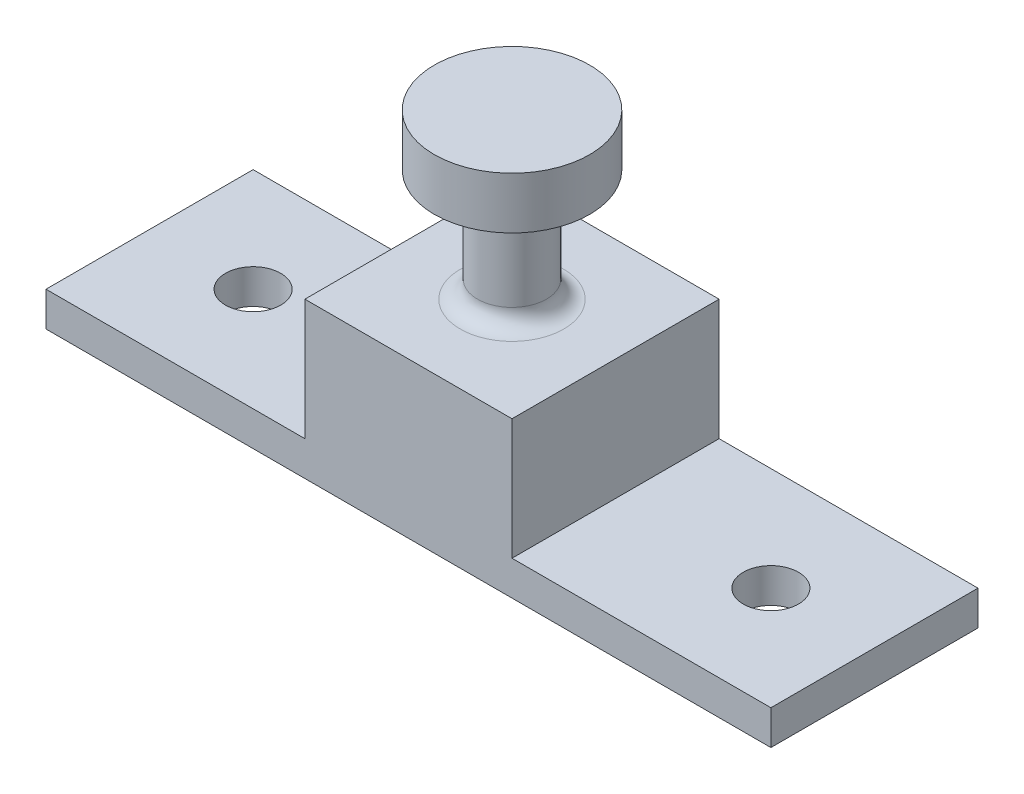
ISO-10303-21;
HEADER;
FILE_DESCRIPTION(('STEP AP214'),'2;1');
FILE_NAME('part.step','',(''),(''),'','','');
FILE_SCHEMA(('AUTOMOTIVE_DESIGN { 1 0 10303 214 1 1 1 1 }'));
ENDSEC;
DATA;
#1=APPLICATION_CONTEXT('core data for automotive mechanical design processes');
#2=APPLICATION_PROTOCOL_DEFINITION('international standard','automotive_design',2000,#1);
#3=PRODUCT_CONTEXT('',#1,'mechanical');
#4=PRODUCT('Part','Part','',(#3));
#5=PRODUCT_RELATED_PRODUCT_CATEGORY('part','',(#4));
#6=PRODUCT_DEFINITION_FORMATION('','',#4);
#7=PRODUCT_DEFINITION_CONTEXT('part definition',#1,'design');
#8=PRODUCT_DEFINITION('design','',#6,#7);
#9=PRODUCT_DEFINITION_SHAPE('','',#8);
#10=(LENGTH_UNIT() NAMED_UNIT(*) SI_UNIT(.MILLI.,.METRE.));
#11=(NAMED_UNIT(*) PLANE_ANGLE_UNIT() SI_UNIT($,.RADIAN.));
#12=(NAMED_UNIT(*) SI_UNIT($,.STERADIAN.) SOLID_ANGLE_UNIT());
#13=UNCERTAINTY_MEASURE_WITH_UNIT(LENGTH_MEASURE(1.E-05),#10,'distance_accuracy_value','');
#14=(GEOMETRIC_REPRESENTATION_CONTEXT(3) GLOBAL_UNCERTAINTY_ASSIGNED_CONTEXT((#13)) GLOBAL_UNIT_ASSIGNED_CONTEXT((#10,
#11,#12)) REPRESENTATION_CONTEXT('',''));
#15=CARTESIAN_POINT('',(0.,0.,0.));
#16=DIRECTION('',(0.,0.,1.));
#17=DIRECTION('',(1.,0.,0.));
#18=AXIS2_PLACEMENT_3D('',#15,#16,#17);
#19=CARTESIAN_POINT('',(0.,2.,0.));
#20=DIRECTION('',(0.,-1.,0.));
#21=DIRECTION('',(0.,0.,-1.));
#22=AXIS2_PLACEMENT_3D('',#19,#20,#21);
#23=PLANE('',#22);
#24=CARTESIAN_POINT('',(15.,2.,0.));
#25=DIRECTION('',(0.,1.,0.));
#26=DIRECTION('',(0.,0.,1.));
#27=AXIS2_PLACEMENT_3D('',#24,#25,#26);
#28=CIRCLE('',#27,1.6);
#29=CARTESIAN_POINT('',(15.,2.,1.6));
#30=VERTEX_POINT('',#29);
#31=EDGE_CURVE('E123',#30,#30,#28,.T.);
#32=ORIENTED_EDGE('',*,*,#31,.F.);
#33=EDGE_LOOP('',(#32));
#34=FACE_BOUND('',#33,.T.);
#35=DIRECTION('',(0.,0.,-1.));
#36=VECTOR('',#35,1.);
#37=CARTESIAN_POINT('',(6.,2.,6.));
#38=LINE('',#37,#36);
#39=CARTESIAN_POINT('',(5.99999999999999,2.,6.));
#40=VERTEX_POINT('',#39);
#41=CARTESIAN_POINT('',(5.99999999999999,2.,-6.));
#42=VERTEX_POINT('',#41);
#43=EDGE_CURVE('E49',#40,#42,#38,.T.);
#44=ORIENTED_EDGE('',*,*,#43,.F.);
#45=DIRECTION('',(1.,0.,0.));
#46=VECTOR('',#45,1.);
#47=CARTESIAN_POINT('',(-21.,2.,6.));
#48=LINE('',#47,#46);
#49=CARTESIAN_POINT('',(21.,2.,6.));
#50=VERTEX_POINT('',#49);
#51=EDGE_CURVE('E147',#40,#50,#48,.T.);
#52=ORIENTED_EDGE('',*,*,#51,.T.);
#53=DIRECTION('',(0.,0.,-1.));
#54=VECTOR('',#53,1.);
#55=CARTESIAN_POINT('',(21.,2.,6.));
#56=LINE('',#55,#54);
#57=CARTESIAN_POINT('',(21.,2.,-6.));
#58=VERTEX_POINT('',#57);
#59=EDGE_CURVE('E138',#50,#58,#56,.T.);
#60=ORIENTED_EDGE('',*,*,#59,.T.);
#61=DIRECTION('',(-1.,0.,0.));
#62=VECTOR('',#61,1.);
#63=CARTESIAN_POINT('',(-21.,2.,-6.));
#64=LINE('',#63,#62);
#65=EDGE_CURVE('E143',#58,#42,#64,.T.);
#66=ORIENTED_EDGE('',*,*,#65,.T.);
#67=EDGE_LOOP('',(#44,#52,#60,#66));
#68=FACE_BOUND('',#67,.T.);
#69=ADVANCED_FACE('F34',(#34,#68),#23,.F.);
#70=CARTESIAN_POINT('',(-15.,2.,0.));
#71=DIRECTION('',(0.,1.,0.));
#72=DIRECTION('',(0.,0.,1.));
#73=AXIS2_PLACEMENT_3D('',#70,#71,#72);
#74=CIRCLE('',#73,1.6);
#75=CARTESIAN_POINT('',(-15.,2.,1.6));
#76=VERTEX_POINT('',#75);
#77=EDGE_CURVE('E132',#76,#76,#74,.T.);
#78=ORIENTED_EDGE('',*,*,#77,.F.);
#79=EDGE_LOOP('',(#78));
#80=FACE_BOUND('',#79,.T.);
#81=DIRECTION('',(0.,0.,1.));
#82=VECTOR('',#81,1.);
#83=CARTESIAN_POINT('',(-6.,2.,6.));
#84=LINE('',#83,#82);
#85=CARTESIAN_POINT('',(-6.,2.,-6.));
#86=VERTEX_POINT('',#85);
#87=CARTESIAN_POINT('',(-6.,2.,6.));
#88=VERTEX_POINT('',#87);
#89=EDGE_CURVE('E57',#86,#88,#84,.T.);
#90=ORIENTED_EDGE('',*,*,#89,.F.);
#91=CARTESIAN_POINT('',(-21.,2.,-6.));
#92=VERTEX_POINT('',#91);
#93=EDGE_CURVE('E141',#86,#92,#64,.T.);
#94=ORIENTED_EDGE('',*,*,#93,.T.);
#95=DIRECTION('',(0.,0.,1.));
#96=VECTOR('',#95,1.);
#97=CARTESIAN_POINT('',(-21.,2.,6.));
#98=LINE('',#97,#96);
#99=CARTESIAN_POINT('',(-21.,2.,6.));
#100=VERTEX_POINT('',#99);
#101=EDGE_CURVE('E145',#92,#100,#98,.T.);
#102=ORIENTED_EDGE('',*,*,#101,.T.);
#103=EDGE_CURVE('E148',#100,#88,#48,.T.);
#104=ORIENTED_EDGE('',*,*,#103,.T.);
#105=EDGE_LOOP('',(#90,#94,#102,#104));
#106=FACE_BOUND('',#105,.T.);
#107=ADVANCED_FACE('F185',(#80,#106),#23,.F.);
#108=CARTESIAN_POINT('',(0.,0.,0.));
#109=DIRECTION('',(0.,-1.,0.));
#110=DIRECTION('',(0.,0.,-1.));
#111=AXIS2_PLACEMENT_3D('',#108,#109,#110);
#112=PLANE('',#111);
#113=CARTESIAN_POINT('',(-15.,0.,0.));
#114=DIRECTION('',(0.,1.,0.));
#115=DIRECTION('',(0.,0.,1.));
#116=AXIS2_PLACEMENT_3D('',#113,#114,#115);
#117=CIRCLE('',#116,1.6);
#118=CARTESIAN_POINT('',(-15.,0.,1.6));
#119=VERTEX_POINT('',#118);
#120=EDGE_CURVE('E130',#119,#119,#117,.T.);
#121=ORIENTED_EDGE('',*,*,#120,.T.);
#122=EDGE_LOOP('',(#121));
#123=FACE_BOUND('',#122,.T.);
#124=DIRECTION('',(0.,0.,-1.));
#125=VECTOR('',#124,1.);
#126=CARTESIAN_POINT('',(21.,0.,6.));
#127=LINE('',#126,#125);
#128=CARTESIAN_POINT('',(21.,0.,6.));
#129=VERTEX_POINT('',#128);
#130=CARTESIAN_POINT('',(21.,0.,-6.));
#131=VERTEX_POINT('',#130);
#132=EDGE_CURVE('E135',#129,#131,#127,.T.);
#133=ORIENTED_EDGE('',*,*,#132,.F.);
#134=DIRECTION('',(1.,0.,0.));
#135=VECTOR('',#134,1.);
#136=CARTESIAN_POINT('',(-21.,0.,6.));
#137=LINE('',#136,#135);
#138=CARTESIAN_POINT('',(-21.,0.,6.));
#139=VERTEX_POINT('',#138);
#140=EDGE_CURVE('E142',#139,#129,#137,.T.);
#141=ORIENTED_EDGE('',*,*,#140,.F.);
#142=DIRECTION('',(0.,0.,1.));
#143=VECTOR('',#142,1.);
#144=CARTESIAN_POINT('',(-21.,0.,6.));
#145=LINE('',#144,#143);
#146=CARTESIAN_POINT('',(-21.,0.,-6.));
#147=VERTEX_POINT('',#146);
#148=EDGE_CURVE('E155',#147,#139,#145,.T.);
#149=ORIENTED_EDGE('',*,*,#148,.F.);
#150=DIRECTION('',(-1.,0.,0.));
#151=VECTOR('',#150,1.);
#152=CARTESIAN_POINT('',(-21.,0.,-6.));
#153=LINE('',#152,#151);
#154=EDGE_CURVE('E153',#131,#147,#153,.T.);
#155=ORIENTED_EDGE('',*,*,#154,.F.);
#156=EDGE_LOOP('',(#133,#141,#149,#155));
#157=FACE_BOUND('',#156,.T.);
#158=CARTESIAN_POINT('',(15.,0.,0.));
#159=DIRECTION('',(0.,1.,0.));
#160=DIRECTION('',(0.,0.,1.));
#161=AXIS2_PLACEMENT_3D('',#158,#159,#160);
#162=CIRCLE('',#161,1.6);
#163=CARTESIAN_POINT('',(15.,0.,1.6));
#164=VERTEX_POINT('',#163);
#165=EDGE_CURVE('E120',#164,#164,#162,.T.);
#166=ORIENTED_EDGE('',*,*,#165,.T.);
#167=EDGE_LOOP('',(#166));
#168=FACE_BOUND('',#167,.T.);
#169=ADVANCED_FACE('F191',(#123,#157,#168),#112,.T.);
#170=CARTESIAN_POINT('',(21.,2.,6.));
#171=DIRECTION('',(-1.,0.,0.));
#172=DIRECTION('',(0.,0.,1.));
#173=AXIS2_PLACEMENT_3D('',#170,#171,#172);
#174=PLANE('',#173);
#175=ORIENTED_EDGE('',*,*,#132,.T.);
#176=DIRECTION('',(0.,-1.,0.));
#177=VECTOR('',#176,1.);
#178=CARTESIAN_POINT('',(21.,2.,-6.));
#179=LINE('',#178,#177);
#180=EDGE_CURVE('E166',#58,#131,#179,.T.);
#181=ORIENTED_EDGE('',*,*,#180,.F.);
#182=ORIENTED_EDGE('',*,*,#59,.F.);
#183=DIRECTION('',(0.,-1.,0.));
#184=VECTOR('',#183,1.);
#185=CARTESIAN_POINT('',(21.,2.,6.));
#186=LINE('',#185,#184);
#187=EDGE_CURVE('E150',#50,#129,#186,.T.);
#188=ORIENTED_EDGE('',*,*,#187,.T.);
#189=EDGE_LOOP('',(#175,#181,#182,#188));
#190=FACE_BOUND('',#189,.T.);
#191=ADVANCED_FACE('F200',(#190),#174,.F.);
#192=CARTESIAN_POINT('',(-21.,2.,-6.));
#193=DIRECTION('',(0.,0.,1.));
#194=DIRECTION('',(1.,0.,0.));
#195=AXIS2_PLACEMENT_3D('',#192,#193,#194);
#196=PLANE('',#195);
#197=ORIENTED_EDGE('',*,*,#154,.T.);
#198=DIRECTION('',(0.,-1.,0.));
#199=VECTOR('',#198,1.);
#200=CARTESIAN_POINT('',(-21.,2.,-6.));
#201=LINE('',#200,#199);
#202=EDGE_CURVE('E163',#92,#147,#201,.T.);
#203=ORIENTED_EDGE('',*,*,#202,.F.);
#204=ORIENTED_EDGE('',*,*,#93,.F.);
#205=DIRECTION('',(0.,-1.,0.));
#206=VECTOR('',#205,1.);
#207=CARTESIAN_POINT('',(-6.,9.,-6.));
#208=LINE('',#207,#206);
#209=CARTESIAN_POINT('',(-6.,9.,-6.));
#210=VERTEX_POINT('',#209);
#211=EDGE_CURVE('E105',#210,#86,#208,.T.);
#212=ORIENTED_EDGE('',*,*,#211,.F.);
#213=DIRECTION('',(-1.,0.,0.));
#214=VECTOR('',#213,1.);
#215=CARTESIAN_POINT('',(-6.,9.,-6.));
#216=LINE('',#215,#214);
#217=CARTESIAN_POINT('',(6.,9.,-6.));
#218=VERTEX_POINT('',#217);
#219=EDGE_CURVE('E99',#218,#210,#216,.T.);
#220=ORIENTED_EDGE('',*,*,#219,.F.);
#221=DIRECTION('',(0.,-1.,0.));
#222=VECTOR('',#221,1.);
#223=CARTESIAN_POINT('',(6.,9.,-6.));
#224=LINE('',#223,#222);
#225=EDGE_CURVE('E103',#218,#42,#224,.T.);
#226=ORIENTED_EDGE('',*,*,#225,.T.);
#227=ORIENTED_EDGE('',*,*,#65,.F.);
#228=ORIENTED_EDGE('',*,*,#180,.T.);
#229=EDGE_LOOP('',(#197,#203,#204,#212,#220,#226,#227,#228));
#230=FACE_BOUND('',#229,.T.);
#231=ADVANCED_FACE('F101',(#230),#196,.F.);
#232=CARTESIAN_POINT('',(-21.,2.,6.));
#233=DIRECTION('',(1.,0.,0.));
#234=DIRECTION('',(0.,0.,-1.));
#235=AXIS2_PLACEMENT_3D('',#232,#233,#234);
#236=PLANE('',#235);
#237=ORIENTED_EDGE('',*,*,#148,.T.);
#238=DIRECTION('',(0.,-1.,0.));
#239=VECTOR('',#238,1.);
#240=CARTESIAN_POINT('',(-21.,2.,6.));
#241=LINE('',#240,#239);
#242=EDGE_CURVE('E160',#100,#139,#241,.T.);
#243=ORIENTED_EDGE('',*,*,#242,.F.);
#244=ORIENTED_EDGE('',*,*,#101,.F.);
#245=ORIENTED_EDGE('',*,*,#202,.T.);
#246=EDGE_LOOP('',(#237,#243,#244,#245));
#247=FACE_BOUND('',#246,.T.);
#248=ADVANCED_FACE('F205',(#247),#236,.F.);
#249=CARTESIAN_POINT('',(-21.,2.,6.));
#250=DIRECTION('',(0.,0.,-1.));
#251=DIRECTION('',(-1.,0.,0.));
#252=AXIS2_PLACEMENT_3D('',#249,#250,#251);
#253=PLANE('',#252);
#254=ORIENTED_EDGE('',*,*,#140,.T.);
#255=ORIENTED_EDGE('',*,*,#187,.F.);
#256=ORIENTED_EDGE('',*,*,#51,.F.);
#257=DIRECTION('',(0.,-1.,0.));
#258=VECTOR('',#257,1.);
#259=CARTESIAN_POINT('',(6.,9.,6.));
#260=LINE('',#259,#258);
#261=CARTESIAN_POINT('',(6.,9.,6.));
#262=VERTEX_POINT('',#261);
#263=EDGE_CURVE('E232',#262,#40,#260,.T.);
#264=ORIENTED_EDGE('',*,*,#263,.F.);
#265=DIRECTION('',(1.,0.,0.));
#266=VECTOR('',#265,1.);
#267=CARTESIAN_POINT('',(-6.,9.,6.));
#268=LINE('',#267,#266);
#269=CARTESIAN_POINT('',(-6.,9.,6.));
#270=VERTEX_POINT('',#269);
#271=EDGE_CURVE('E114',#270,#262,#268,.T.);
#272=ORIENTED_EDGE('',*,*,#271,.F.);
#273=DIRECTION('',(0.,-1.,0.));
#274=VECTOR('',#273,1.);
#275=CARTESIAN_POINT('',(-6.,9.,6.));
#276=LINE('',#275,#274);
#277=EDGE_CURVE('E125',#270,#88,#276,.T.);
#278=ORIENTED_EDGE('',*,*,#277,.T.);
#279=ORIENTED_EDGE('',*,*,#103,.F.);
#280=ORIENTED_EDGE('',*,*,#242,.T.);
#281=EDGE_LOOP('',(#254,#255,#256,#264,#272,#278,#279,#280));
#282=FACE_BOUND('',#281,.T.);
#283=ADVANCED_FACE('F202',(#282),#253,.F.);
#284=CARTESIAN_POINT('',(-15.,2.,0.));
#285=DIRECTION('',(0.,-1.,0.));
#286=DIRECTION('',(0.,0.,-1.));
#287=AXIS2_PLACEMENT_3D('',#284,#285,#286);
#288=CYLINDRICAL_SURFACE('',#287,1.6);
#289=ORIENTED_EDGE('',*,*,#77,.T.);
#290=EDGE_LOOP('',(#289));
#291=FACE_BOUND('',#290,.T.);
#292=ORIENTED_EDGE('',*,*,#120,.F.);
#293=EDGE_LOOP('',(#292));
#294=FACE_BOUND('',#293,.T.);
#295=ADVANCED_FACE('F196',(#291,#294),#288,.F.);
#296=CARTESIAN_POINT('',(15.,2.,0.));
#297=DIRECTION('',(0.,-1.,0.));
#298=DIRECTION('',(0.,0.,-1.));
#299=AXIS2_PLACEMENT_3D('',#296,#297,#298);
#300=CYLINDRICAL_SURFACE('',#299,1.6);
#301=ORIENTED_EDGE('',*,*,#31,.T.);
#302=EDGE_LOOP('',(#301));
#303=FACE_BOUND('',#302,.T.);
#304=ORIENTED_EDGE('',*,*,#165,.F.);
#305=EDGE_LOOP('',(#304));
#306=FACE_BOUND('',#305,.T.);
#307=ADVANCED_FACE('F269',(#303,#306),#300,.F.);
#308=CARTESIAN_POINT('',(6.,9.,6.));
#309=DIRECTION('',(-1.,0.,0.));
#310=DIRECTION('',(0.,0.,1.));
#311=AXIS2_PLACEMENT_3D('',#308,#309,#310);
#312=PLANE('',#311);
#313=ORIENTED_EDGE('',*,*,#43,.T.);
#314=ORIENTED_EDGE('',*,*,#225,.F.);
#315=DIRECTION('',(0.,0.,-1.));
#316=VECTOR('',#315,1.);
#317=CARTESIAN_POINT('',(6.,9.,6.));
#318=LINE('',#317,#316);
#319=EDGE_CURVE('E109',#262,#218,#318,.T.);
#320=ORIENTED_EDGE('',*,*,#319,.F.);
#321=ORIENTED_EDGE('',*,*,#263,.T.);
#322=EDGE_LOOP('',(#313,#314,#320,#321));
#323=FACE_BOUND('',#322,.T.);
#324=ADVANCED_FACE('F119',(#323),#312,.F.);
#325=CARTESIAN_POINT('',(-6.,9.,6.));
#326=DIRECTION('',(1.,0.,0.));
#327=DIRECTION('',(0.,0.,-1.));
#328=AXIS2_PLACEMENT_3D('',#325,#326,#327);
#329=PLANE('',#328);
#330=ORIENTED_EDGE('',*,*,#89,.T.);
#331=ORIENTED_EDGE('',*,*,#277,.F.);
#332=DIRECTION('',(0.,0.,1.));
#333=VECTOR('',#332,1.);
#334=CARTESIAN_POINT('',(-6.,9.,6.));
#335=LINE('',#334,#333);
#336=EDGE_CURVE('E108',#210,#270,#335,.T.);
#337=ORIENTED_EDGE('',*,*,#336,.F.);
#338=ORIENTED_EDGE('',*,*,#211,.T.);
#339=EDGE_LOOP('',(#330,#331,#337,#338));
#340=FACE_BOUND('',#339,.T.);
#341=ADVANCED_FACE('F229',(#340),#329,.F.);
#342=CARTESIAN_POINT('',(0.,9.,0.));
#343=DIRECTION('',(0.,-1.,0.));
#344=DIRECTION('',(0.,0.,-1.));
#345=AXIS2_PLACEMENT_3D('',#342,#343,#344);
#346=PLANE('',#345);
#347=CARTESIAN_POINT('',(0.,9.,0.));
#348=DIRECTION('',(0.,-1.,0.));
#349=DIRECTION('',(0.,0.,-1.));
#350=AXIS2_PLACEMENT_3D('',#347,#348,#349);
#351=CIRCLE('',#350,3.);
#352=CARTESIAN_POINT('',(0.,9.,-3.));
#353=VERTEX_POINT('',#352);
#354=EDGE_CURVE('E11',#353,#353,#351,.T.);
#355=ORIENTED_EDGE('',*,*,#354,.T.);
#356=EDGE_LOOP('',(#355));
#357=FACE_BOUND('',#356,.T.);
#358=ORIENTED_EDGE('',*,*,#319,.T.);
#359=ORIENTED_EDGE('',*,*,#219,.T.);
#360=ORIENTED_EDGE('',*,*,#336,.T.);
#361=ORIENTED_EDGE('',*,*,#271,.T.);
#362=EDGE_LOOP('',(#358,#359,#360,#361));
#363=FACE_BOUND('',#362,.T.);
#364=ADVANCED_FACE('F112',(#357,#363),#346,.F.);
#365=CARTESIAN_POINT('',(0.,15.5,0.));
#366=DIRECTION('',(0.,-1.,0.));
#367=DIRECTION('',(0.,0.,-1.));
#368=AXIS2_PLACEMENT_3D('',#365,#366,#367);
#369=CYLINDRICAL_SURFACE('',#368,2.);
#370=CARTESIAN_POINT('',(0.,10.,0.));
#371=DIRECTION('',(0.,-1.,0.));
#372=DIRECTION('',(0.,0.,-1.));
#373=AXIS2_PLACEMENT_3D('',#370,#371,#372);
#374=CIRCLE('',#373,2.);
#375=CARTESIAN_POINT('',(0.,10.,-2.));
#376=VERTEX_POINT('',#375);
#377=EDGE_CURVE('E42',#376,#376,#374,.F.);
#378=CARTESIAN_POINT('',(0.,15.5,0.));
#379=DIRECTION('',(0.,1.,0.));
#380=DIRECTION('',(0.,0.,1.));
#381=AXIS2_PLACEMENT_3D('',#378,#379,#380);
#382=CIRCLE('',#381,2.);
#383=CARTESIAN_POINT('',(0.,15.5,-2.));
#384=VERTEX_POINT('',#383);
#385=EDGE_CURVE('E236',#384,#384,#382,.T.);
#386=CARTESIAN_POINT('',(0.,10.,-2.));
#387=CARTESIAN_POINT('',(0.,10.0572916666667,-2.));
#388=CARTESIAN_POINT('',(0.,10.1145833333333,-2.));
#389=CARTESIAN_POINT('',(0.,10.2291666666667,-2.));
#390=CARTESIAN_POINT('',(0.,10.2864583333333,-2.));
#391=CARTESIAN_POINT('',(0.,10.4010416666667,-2.));
#392=CARTESIAN_POINT('',(0.,10.4583333333333,-2.));
#393=CARTESIAN_POINT('',(0.,10.5729166666667,-2.));
#394=CARTESIAN_POINT('',(0.,10.6302083333333,-2.));
#395=CARTESIAN_POINT('',(0.,10.7447916666667,-2.));
#396=CARTESIAN_POINT('',(0.,10.8020833333333,-2.));
#397=CARTESIAN_POINT('',(0.,10.9166666666667,-2.));
#398=CARTESIAN_POINT('',(0.,10.9739583333333,-2.));
#399=CARTESIAN_POINT('',(0.,11.0885416666667,-2.));
#400=CARTESIAN_POINT('',(0.,11.1458333333333,-2.));
#401=CARTESIAN_POINT('',(0.,11.2604166666667,-2.));
#402=CARTESIAN_POINT('',(0.,11.3177083333333,-2.));
#403=CARTESIAN_POINT('',(0.,11.4322916666667,-2.));
#404=CARTESIAN_POINT('',(0.,11.4895833333333,-2.));
#405=CARTESIAN_POINT('',(0.,11.6041666666667,-2.));
#406=CARTESIAN_POINT('',(0.,11.6614583333333,-2.));
#407=CARTESIAN_POINT('',(0.,11.7760416666667,-2.));
#408=CARTESIAN_POINT('',(0.,11.8333333333333,-2.));
#409=CARTESIAN_POINT('',(0.,11.9479166666667,-2.));
#410=CARTESIAN_POINT('',(0.,12.0052083333333,-2.));
#411=CARTESIAN_POINT('',(0.,12.1197916666667,-2.));
#412=CARTESIAN_POINT('',(0.,12.1770833333333,-2.));
#413=CARTESIAN_POINT('',(0.,12.2916666666667,-2.));
#414=CARTESIAN_POINT('',(0.,12.3489583333333,-2.));
#415=CARTESIAN_POINT('',(0.,12.4635416666667,-2.));
#416=CARTESIAN_POINT('',(0.,12.5208333333333,-2.));
#417=CARTESIAN_POINT('',(0.,12.6354166666667,-2.));
#418=CARTESIAN_POINT('',(0.,12.6927083333333,-2.));
#419=CARTESIAN_POINT('',(0.,12.8072916666667,-2.));
#420=CARTESIAN_POINT('',(0.,12.8645833333333,-2.));
#421=CARTESIAN_POINT('',(0.,12.9791666666667,-2.));
#422=CARTESIAN_POINT('',(0.,13.0364583333333,-2.));
#423=CARTESIAN_POINT('',(0.,13.1510416666667,-2.));
#424=CARTESIAN_POINT('',(0.,13.2083333333333,-2.));
#425=CARTESIAN_POINT('',(0.,13.3229166666667,-2.));
#426=CARTESIAN_POINT('',(0.,13.3802083333333,-2.));
#427=CARTESIAN_POINT('',(0.,13.4947916666667,-2.));
#428=CARTESIAN_POINT('',(0.,13.5520833333333,-2.));
#429=CARTESIAN_POINT('',(0.,13.6666666666667,-2.));
#430=CARTESIAN_POINT('',(0.,13.7239583333333,-2.));
#431=CARTESIAN_POINT('',(0.,13.8385416666667,-2.));
#432=CARTESIAN_POINT('',(0.,13.8958333333333,-2.));
#433=CARTESIAN_POINT('',(0.,14.0104166666667,-2.));
#434=CARTESIAN_POINT('',(0.,14.0677083333333,-2.));
#435=CARTESIAN_POINT('',(0.,14.1822916666667,-2.));
#436=CARTESIAN_POINT('',(0.,14.2395833333333,-2.));
#437=CARTESIAN_POINT('',(0.,14.3541666666667,-2.));
#438=CARTESIAN_POINT('',(0.,14.4114583333333,-2.));
#439=CARTESIAN_POINT('',(0.,14.5260416666667,-2.));
#440=CARTESIAN_POINT('',(0.,14.5833333333333,-2.));
#441=CARTESIAN_POINT('',(0.,14.6979166666667,-2.));
#442=CARTESIAN_POINT('',(0.,14.7552083333333,-2.));
#443=CARTESIAN_POINT('',(0.,14.8697916666667,-2.));
#444=CARTESIAN_POINT('',(0.,14.9270833333333,-2.));
#445=CARTESIAN_POINT('',(0.,15.0416666666667,-2.));
#446=CARTESIAN_POINT('',(0.,15.0989583333333,-2.));
#447=CARTESIAN_POINT('',(0.,15.2135416666667,-2.));
#448=CARTESIAN_POINT('',(0.,15.2708333333333,-2.));
#449=CARTESIAN_POINT('',(0.,15.3854166666667,-2.));
#450=CARTESIAN_POINT('',(0.,15.4427083333333,-2.));
#451=CARTESIAN_POINT('',(0.,15.5,-2.));
#452=B_SPLINE_CURVE_WITH_KNOTS('',3,(#386,#387,#388,#389,#390,#391,#392,#393,#394,#395,#396,
#397,#398,#399,#400,#401,#402,#403,#404,#405,#406,#407,#408,#409,#410,#411,#412,#413,#414,#415,
#416,#417,#418,#419,#420,#421,#422,#423,#424,#425,#426,#427,#428,#429,#430,#431,#432,#433,#434,
#435,#436,#437,#438,#439,#440,#441,#442,#443,#444,#445,#446,#447,#448,#449,#450,#451),
.UNSPECIFIED.,.F.,.F.,(4,2,2,2,2,2,2,2,2,2,2,2,2,2,2,2,2,2,2,2,2,2,2,2,2,2,2,2,2,2,2,2,4),(0.,
0.171875000000002,0.34375,0.515625,0.687500000000001,0.859375000000001,1.03125,1.203125,1.375,
1.546875,1.71875,1.890625,2.0625,2.234375,2.40625,2.578125,2.75,2.921875,3.09375,3.265625,
3.4375,3.609375,3.78125,3.953125,4.125,4.296875,4.46875,4.640625,4.8125,4.984375,5.15625,
5.328125,5.5),.UNSPECIFIED.);
#453=EDGE_CURVE('BSEAM171',#376,#384,#452,.T.);
#454=ORIENTED_EDGE('',*,*,#377,.T.);
#455=ORIENTED_EDGE('',*,*,#385,.F.);
#456=ORIENTED_EDGE('',*,*,#453,.T.);
#457=ORIENTED_EDGE('',*,*,#453,.F.);
#458=EDGE_LOOP('',(#454,#456,#455,#457));
#459=FACE_BOUND('',#458,.T.);
#460=ADVANCED_FACE('F171',(#459),#369,.T.);
#461=CARTESIAN_POINT('',(0.,18.5,0.));
#462=DIRECTION('',(0.,-1.,0.));
#463=DIRECTION('',(0.,0.,-1.));
#464=AXIS2_PLACEMENT_3D('',#461,#462,#463);
#465=CYLINDRICAL_SURFACE('',#464,4.5);
#466=CARTESIAN_POINT('',(0.,18.5,0.));
#467=DIRECTION('',(0.,1.,0.));
#468=DIRECTION('',(0.,0.,1.));
#469=AXIS2_PLACEMENT_3D('',#466,#467,#468);
#470=CIRCLE('',#469,4.5);
#471=CARTESIAN_POINT('',(0.,18.5,4.5));
#472=VERTEX_POINT('',#471);
#473=EDGE_CURVE('E239',#472,#472,#470,.T.);
#474=ORIENTED_EDGE('',*,*,#473,.F.);
#475=EDGE_LOOP('',(#474));
#476=FACE_BOUND('',#475,.T.);
#477=CARTESIAN_POINT('',(0.,15.5,0.));
#478=DIRECTION('',(0.,1.,0.));
#479=DIRECTION('',(0.,0.,1.));
#480=AXIS2_PLACEMENT_3D('',#477,#478,#479);
#481=CIRCLE('',#480,4.5);
#482=CARTESIAN_POINT('',(0.,15.5,4.5));
#483=VERTEX_POINT('',#482);
#484=EDGE_CURVE('E243',#483,#483,#481,.T.);
#485=ORIENTED_EDGE('',*,*,#484,.T.);
#486=EDGE_LOOP('',(#485));
#487=FACE_BOUND('',#486,.T.);
#488=ADVANCED_FACE('F249',(#476,#487),#465,.T.);
#489=CARTESIAN_POINT('',(0.,18.5,0.));
#490=DIRECTION('',(0.,1.,0.));
#491=DIRECTION('',(0.,0.,1.));
#492=AXIS2_PLACEMENT_3D('',#489,#490,#491);
#493=PLANE('',#492);
#494=ORIENTED_EDGE('',*,*,#473,.T.);
#495=EDGE_LOOP('',(#494));
#496=FACE_BOUND('',#495,.T.);
#497=ADVANCED_FACE('F180',(#496),#493,.T.);
#498=CARTESIAN_POINT('',(0.,15.5,0.));
#499=DIRECTION('',(0.,1.,0.));
#500=DIRECTION('',(0.,0.,1.));
#501=AXIS2_PLACEMENT_3D('',#498,#499,#500);
#502=PLANE('',#501);
#503=ORIENTED_EDGE('',*,*,#385,.T.);
#504=EDGE_LOOP('',(#503));
#505=FACE_BOUND('',#504,.T.);
#506=ORIENTED_EDGE('',*,*,#484,.F.);
#507=EDGE_LOOP('',(#506));
#508=FACE_BOUND('',#507,.T.);
#509=ADVANCED_FACE('F175',(#505,#508),#502,.F.);
#510=CARTESIAN_POINT('',(0.,10.,0.));
#511=DIRECTION('',(0.,-1.,0.));
#512=DIRECTION('',(0.,0.,-1.));
#513=AXIS2_PLACEMENT_3D('',#510,#511,#512);
#514=TOROIDAL_SURFACE('',#513,3.,1.);
#515=ORIENTED_EDGE('',*,*,#354,.F.);
#516=EDGE_LOOP('',(#515));
#517=FACE_BOUND('',#516,.T.);
#518=ORIENTED_EDGE('',*,*,#377,.F.);
#519=EDGE_LOOP('',(#518));
#520=FACE_BOUND('',#519,.T.);
#521=ADVANCED_FACE('F36',(#517,#520),#514,.F.);
#522=CLOSED_SHELL('',(#69,#107,#169,#191,#231,#248,#283,#295,#307,#324,#341,#364,#460,#488,#497,
#509,#521));
#523=MANIFOLD_SOLID_BREP('B2',#522);
#524=ADVANCED_BREP_SHAPE_REPRESENTATION('',(#18,#523),#14);
#525=SHAPE_DEFINITION_REPRESENTATION(#9,#524);
ENDSEC;
END-ISO-10303-21;
